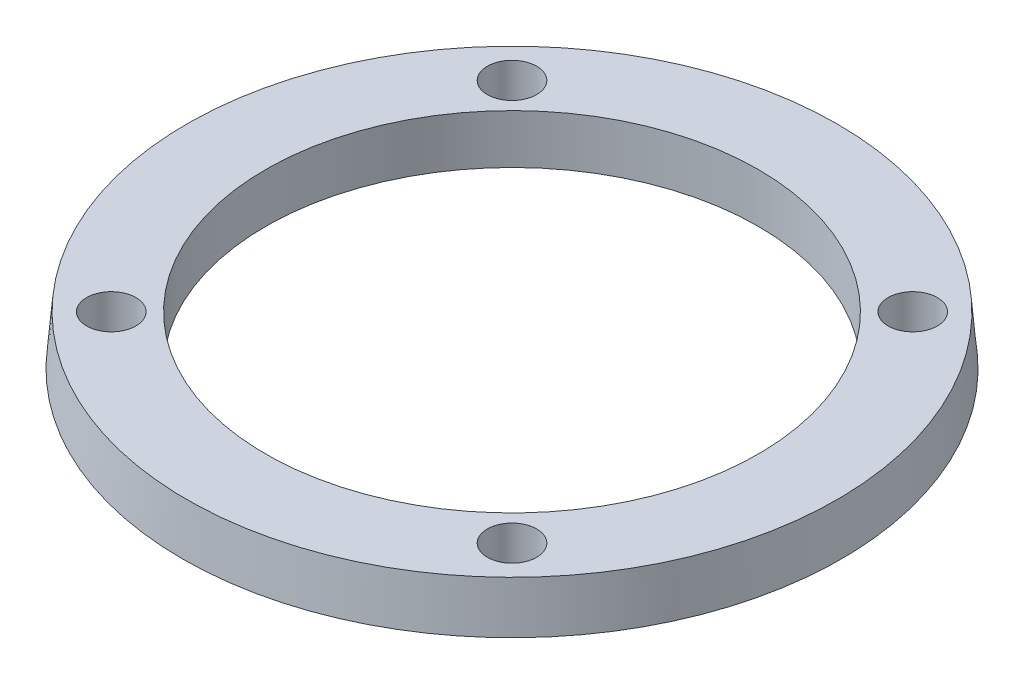
ISO-10303-21;
HEADER;
FILE_DESCRIPTION(('STEP AP214'),'2;1');
FILE_NAME('part.step','',(''),(''),'','','');
FILE_SCHEMA(('AUTOMOTIVE_DESIGN { 1 0 10303 214 1 1 1 1 }'));
ENDSEC;
DATA;
#1=APPLICATION_CONTEXT('core data for automotive mechanical design processes');
#2=APPLICATION_PROTOCOL_DEFINITION('international standard','automotive_design',2000,#1);
#3=PRODUCT_CONTEXT('',#1,'mechanical');
#4=PRODUCT('Part','Part','',(#3));
#5=PRODUCT_RELATED_PRODUCT_CATEGORY('part','',(#4));
#6=PRODUCT_DEFINITION_FORMATION('','',#4);
#7=PRODUCT_DEFINITION_CONTEXT('part definition',#1,'design');
#8=PRODUCT_DEFINITION('design','',#6,#7);
#9=PRODUCT_DEFINITION_SHAPE('','',#8);
#10=(LENGTH_UNIT() NAMED_UNIT(*) SI_UNIT(.MILLI.,.METRE.));
#11=(NAMED_UNIT(*) PLANE_ANGLE_UNIT() SI_UNIT($,.RADIAN.));
#12=(NAMED_UNIT(*) SI_UNIT($,.STERADIAN.) SOLID_ANGLE_UNIT());
#13=UNCERTAINTY_MEASURE_WITH_UNIT(LENGTH_MEASURE(1.E-05),#10,'distance_accuracy_value','');
#14=(GEOMETRIC_REPRESENTATION_CONTEXT(3) GLOBAL_UNCERTAINTY_ASSIGNED_CONTEXT((#13)) GLOBAL_UNIT_ASSIGNED_CONTEXT((#10,
#11,#12)) REPRESENTATION_CONTEXT('',''));
#15=CARTESIAN_POINT('',(0.,0.,0.));
#16=DIRECTION('',(0.,0.,1.));
#17=DIRECTION('',(1.,0.,0.));
#18=AXIS2_PLACEMENT_3D('',#15,#16,#17);
#19=CARTESIAN_POINT('',(0.,0.,0.));
#20=DIRECTION('',(0.,-1.,0.));
#21=DIRECTION('',(0.,0.,-1.));
#22=AXIS2_PLACEMENT_3D('',#19,#20,#21);
#23=CYLINDRICAL_SURFACE('',#22,20.);
#24=CARTESIAN_POINT('',(0.,4.,0.));
#25=DIRECTION('',(0.,-1.,0.));
#26=DIRECTION('',(0.,0.,-1.));
#27=AXIS2_PLACEMENT_3D('',#24,#25,#26);
#28=CIRCLE('',#27,20.);
#29=CARTESIAN_POINT('',(0.,4.,-20.));
#30=VERTEX_POINT('',#29);
#31=EDGE_CURVE('E10',#30,#30,#28,.T.);
#32=ORIENTED_EDGE('',*,*,#31,.F.);
#33=EDGE_LOOP('',(#32));
#34=FACE_BOUND('',#33,.T.);
#35=CARTESIAN_POINT('',(0.,0.,0.));
#36=DIRECTION('',(0.,-1.,0.));
#37=DIRECTION('',(0.,0.,-1.));
#38=AXIS2_PLACEMENT_3D('',#35,#36,#37);
#39=CIRCLE('',#38,20.);
#40=CARTESIAN_POINT('',(0.,0.,-20.));
#41=VERTEX_POINT('',#40);
#42=EDGE_CURVE('E52',#41,#41,#39,.T.);
#43=ORIENTED_EDGE('',*,*,#42,.T.);
#44=EDGE_LOOP('',(#43));
#45=FACE_BOUND('',#44,.T.);
#46=ADVANCED_FACE('F34',(#34,#45),#23,.F.);
#47=CARTESIAN_POINT('',(-20.,4.,0.));
#48=DIRECTION('',(0.,-1.,0.));
#49=DIRECTION('',(0.,0.,-1.));
#50=AXIS2_PLACEMENT_3D('',#47,#48,#49);
#51=PLANE('',#50);
#52=CARTESIAN_POINT('',(16.2634559672908,4.,16.2634559672907));
#53=DIRECTION('',(0.,-1.,0.));
#54=DIRECTION('',(0.,0.,-1.));
#55=AXIS2_PLACEMENT_3D('',#52,#53,#54);
#56=CIRCLE('',#55,2.);
#57=CARTESIAN_POINT('',(16.2634559672908,4.,14.2634559672907));
#58=VERTEX_POINT('',#57);
#59=EDGE_CURVE('E62',#58,#58,#56,.T.);
#60=ORIENTED_EDGE('',*,*,#59,.T.);
#61=EDGE_LOOP('',(#60));
#62=FACE_BOUND('',#61,.T.);
#63=CARTESIAN_POINT('',(-16.2634559672906,4.,-16.2634559672905));
#64=DIRECTION('',(0.,-1.,0.));
#65=DIRECTION('',(0.,0.,-1.));
#66=AXIS2_PLACEMENT_3D('',#63,#64,#65);
#67=CIRCLE('',#66,2.);
#68=CARTESIAN_POINT('',(-16.2634559672906,4.,-18.2634559672905));
#69=VERTEX_POINT('',#68);
#70=EDGE_CURVE('E75',#69,#69,#67,.T.);
#71=ORIENTED_EDGE('',*,*,#70,.T.);
#72=EDGE_LOOP('',(#71));
#73=FACE_BOUND('',#72,.T.);
#74=CARTESIAN_POINT('',(16.2634559672905,4.,-16.2634559672905));
#75=DIRECTION('',(0.,-1.,0.));
#76=DIRECTION('',(0.,0.,-1.));
#77=AXIS2_PLACEMENT_3D('',#74,#75,#76);
#78=CIRCLE('',#77,2.00000000000001);
#79=CARTESIAN_POINT('',(16.2634559672905,4.,-18.2634559672905));
#80=VERTEX_POINT('',#79);
#81=EDGE_CURVE('E68',#80,#80,#78,.T.);
#82=ORIENTED_EDGE('',*,*,#81,.T.);
#83=EDGE_LOOP('',(#82));
#84=FACE_BOUND('',#83,.T.);
#85=CARTESIAN_POINT('',(-16.2634559672906,4.,16.2634559672907));
#86=DIRECTION('',(0.,-1.,0.));
#87=DIRECTION('',(0.,0.,-1.));
#88=AXIS2_PLACEMENT_3D('',#85,#86,#87);
#89=CIRCLE('',#88,2.);
#90=CARTESIAN_POINT('',(-16.2634559672906,4.,14.2634559672907));
#91=VERTEX_POINT('',#90);
#92=EDGE_CURVE('E58',#91,#91,#89,.T.);
#93=ORIENTED_EDGE('',*,*,#92,.T.);
#94=EDGE_LOOP('',(#93));
#95=FACE_BOUND('',#94,.T.);
#96=CARTESIAN_POINT('',(0.,4.,0.));
#97=DIRECTION('',(0.,-1.,0.));
#98=DIRECTION('',(0.,0.,-1.));
#99=AXIS2_PLACEMENT_3D('',#96,#97,#98);
#100=CIRCLE('',#99,26.4000453458963);
#101=CARTESIAN_POINT('',(0.,4.,-26.4000453458963));
#102=VERTEX_POINT('',#101);
#103=EDGE_CURVE('E41',#102,#102,#100,.T.);
#104=ORIENTED_EDGE('',*,*,#103,.F.);
#105=EDGE_LOOP('',(#104));
#106=FACE_BOUND('',#105,.T.);
#107=ORIENTED_EDGE('',*,*,#31,.T.);
#108=EDGE_LOOP('',(#107));
#109=FACE_BOUND('',#108,.T.);
#110=ADVANCED_FACE('F84',(#62,#73,#84,#95,#106,#109),#51,.F.);
#111=CARTESIAN_POINT('',(0.,4.,0.));
#112=DIRECTION('',(0.,-1.,0.));
#113=DIRECTION('',(0.,0.,-1.));
#114=AXIS2_PLACEMENT_3D('',#111,#112,#113);
#115=CONICAL_SURFACE('',#114,26.4000453458963,0.0872664625997169);
#116=CARTESIAN_POINT('',(0.,0.,0.));
#117=DIRECTION('',(0.,-1.,0.));
#118=DIRECTION('',(0.,0.,-1.));
#119=AXIS2_PLACEMENT_3D('',#116,#117,#118);
#120=CIRCLE('',#119,26.75);
#121=CARTESIAN_POINT('',(0.,0.,-26.75));
#122=VERTEX_POINT('',#121);
#123=EDGE_CURVE('E47',#122,#122,#120,.T.);
#124=ORIENTED_EDGE('',*,*,#123,.F.);
#125=EDGE_LOOP('',(#124));
#126=FACE_BOUND('',#125,.T.);
#127=ORIENTED_EDGE('',*,*,#103,.T.);
#128=EDGE_LOOP('',(#127));
#129=FACE_BOUND('',#128,.T.);
#130=ADVANCED_FACE('F98',(#126,#129),#115,.T.);
#131=CARTESIAN_POINT('',(-20.,0.,0.));
#132=DIRECTION('',(0.,1.,0.));
#133=DIRECTION('',(0.,0.,1.));
#134=AXIS2_PLACEMENT_3D('',#131,#132,#133);
#135=PLANE('',#134);
#136=CARTESIAN_POINT('',(16.2634559672908,0.,16.2634559672907));
#137=DIRECTION('',(0.,-1.,0.));
#138=DIRECTION('',(0.,0.,-1.));
#139=AXIS2_PLACEMENT_3D('',#136,#137,#138);
#140=CIRCLE('',#139,2.);
#141=CARTESIAN_POINT('',(16.2634559672908,0.,14.2634559672907));
#142=VERTEX_POINT('',#141);
#143=EDGE_CURVE('E78',#142,#142,#140,.T.);
#144=ORIENTED_EDGE('',*,*,#143,.F.);
#145=EDGE_LOOP('',(#144));
#146=FACE_BOUND('',#145,.T.);
#147=CARTESIAN_POINT('',(-16.2634559672906,0.,-16.2634559672905));
#148=DIRECTION('',(0.,-1.,0.));
#149=DIRECTION('',(0.,0.,-1.));
#150=AXIS2_PLACEMENT_3D('',#147,#148,#149);
#151=CIRCLE('',#150,2.);
#152=CARTESIAN_POINT('',(-16.2634559672906,0.,-18.2634559672905));
#153=VERTEX_POINT('',#152);
#154=EDGE_CURVE('E71',#153,#153,#151,.T.);
#155=ORIENTED_EDGE('',*,*,#154,.F.);
#156=EDGE_LOOP('',(#155));
#157=FACE_BOUND('',#156,.T.);
#158=CARTESIAN_POINT('',(16.2634559672905,0.,-16.2634559672905));
#159=DIRECTION('',(0.,-1.,0.));
#160=DIRECTION('',(0.,0.,-1.));
#161=AXIS2_PLACEMENT_3D('',#158,#159,#160);
#162=CIRCLE('',#161,2.00000000000001);
#163=CARTESIAN_POINT('',(16.2634559672905,0.,-18.2634559672905));
#164=VERTEX_POINT('',#163);
#165=EDGE_CURVE('E65',#164,#164,#162,.T.);
#166=ORIENTED_EDGE('',*,*,#165,.F.);
#167=EDGE_LOOP('',(#166));
#168=FACE_BOUND('',#167,.T.);
#169=CARTESIAN_POINT('',(-16.2634559672906,0.,16.2634559672907));
#170=DIRECTION('',(0.,-1.,0.));
#171=DIRECTION('',(0.,0.,-1.));
#172=AXIS2_PLACEMENT_3D('',#169,#170,#171);
#173=CIRCLE('',#172,2.);
#174=CARTESIAN_POINT('',(-16.2634559672906,0.,14.2634559672907));
#175=VERTEX_POINT('',#174);
#176=EDGE_CURVE('E59',#175,#175,#173,.T.);
#177=ORIENTED_EDGE('',*,*,#176,.F.);
#178=EDGE_LOOP('',(#177));
#179=FACE_BOUND('',#178,.T.);
#180=ORIENTED_EDGE('',*,*,#42,.F.);
#181=EDGE_LOOP('',(#180));
#182=FACE_BOUND('',#181,.T.);
#183=ORIENTED_EDGE('',*,*,#123,.T.);
#184=EDGE_LOOP('',(#183));
#185=FACE_BOUND('',#184,.T.);
#186=ADVANCED_FACE('F94',(#146,#157,#168,#179,#182,#185),#135,.F.);
#187=CARTESIAN_POINT('',(-16.2634559672906,4.,16.2634559672907));
#188=DIRECTION('',(0.,-1.,0.));
#189=DIRECTION('',(0.,0.,-1.));
#190=AXIS2_PLACEMENT_3D('',#187,#188,#189);
#191=CYLINDRICAL_SURFACE('',#190,2.);
#192=ORIENTED_EDGE('',*,*,#92,.F.);
#193=EDGE_LOOP('',(#192));
#194=FACE_BOUND('',#193,.T.);
#195=ORIENTED_EDGE('',*,*,#176,.T.);
#196=EDGE_LOOP('',(#195));
#197=FACE_BOUND('',#196,.T.);
#198=ADVANCED_FACE('F97',(#194,#197),#191,.F.);
#199=CARTESIAN_POINT('',(16.2634559672905,4.,-16.2634559672905));
#200=DIRECTION('',(0.,-1.,0.));
#201=DIRECTION('',(0.,0.,-1.));
#202=AXIS2_PLACEMENT_3D('',#199,#200,#201);
#203=CYLINDRICAL_SURFACE('',#202,2.00000000000001);
#204=ORIENTED_EDGE('',*,*,#81,.F.);
#205=EDGE_LOOP('',(#204));
#206=FACE_BOUND('',#205,.T.);
#207=ORIENTED_EDGE('',*,*,#165,.T.);
#208=EDGE_LOOP('',(#207));
#209=FACE_BOUND('',#208,.T.);
#210=ADVANCED_FACE('F141',(#206,#209),#203,.F.);
#211=CARTESIAN_POINT('',(-16.2634559672906,4.,-16.2634559672905));
#212=DIRECTION('',(0.,-1.,0.));
#213=DIRECTION('',(0.,0.,-1.));
#214=AXIS2_PLACEMENT_3D('',#211,#212,#213);
#215=CYLINDRICAL_SURFACE('',#214,2.);
#216=ORIENTED_EDGE('',*,*,#70,.F.);
#217=EDGE_LOOP('',(#216));
#218=FACE_BOUND('',#217,.T.);
#219=ORIENTED_EDGE('',*,*,#154,.T.);
#220=EDGE_LOOP('',(#219));
#221=FACE_BOUND('',#220,.T.);
#222=ADVANCED_FACE('F90',(#218,#221),#215,.F.);
#223=CARTESIAN_POINT('',(16.2634559672908,4.,16.2634559672907));
#224=DIRECTION('',(0.,-1.,0.));
#225=DIRECTION('',(0.,0.,-1.));
#226=AXIS2_PLACEMENT_3D('',#223,#224,#225);
#227=CYLINDRICAL_SURFACE('',#226,2.);
#228=ORIENTED_EDGE('',*,*,#59,.F.);
#229=EDGE_LOOP('',(#228));
#230=FACE_BOUND('',#229,.T.);
#231=ORIENTED_EDGE('',*,*,#143,.T.);
#232=EDGE_LOOP('',(#231));
#233=FACE_BOUND('',#232,.T.);
#234=ADVANCED_FACE('F87',(#230,#233),#227,.F.);
#235=CLOSED_SHELL('',(#46,#110,#130,#186,#198,#210,#222,#234));
#236=MANIFOLD_SOLID_BREP('B2',#235);
#237=ADVANCED_BREP_SHAPE_REPRESENTATION('',(#18,#236),#14);
#238=SHAPE_DEFINITION_REPRESENTATION(#9,#237);
ENDSEC;
END-ISO-10303-21;
